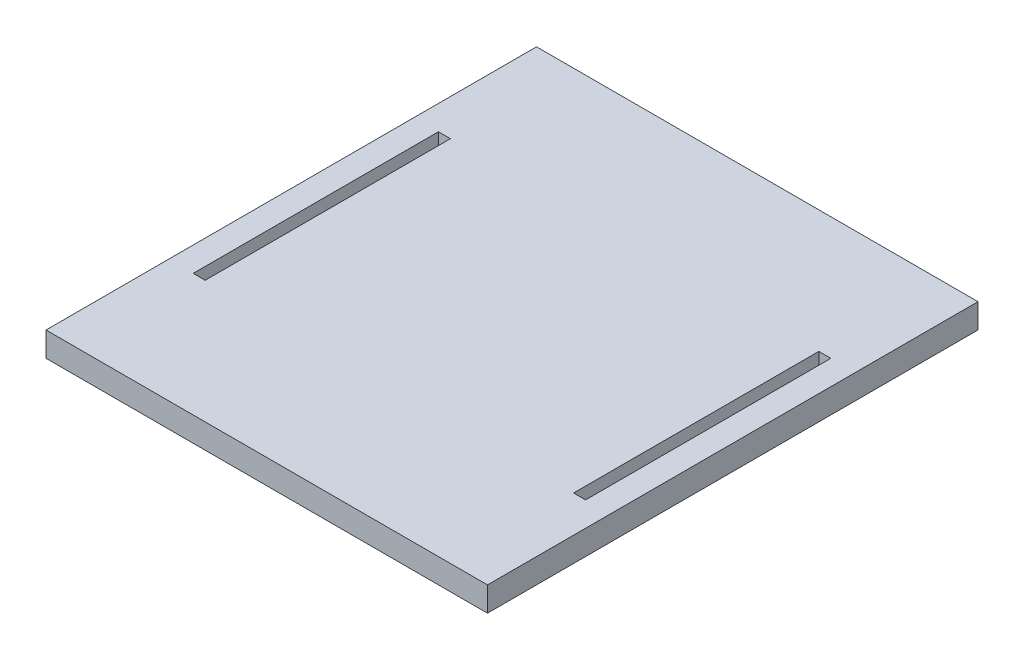
ISO-10303-21;
HEADER;
FILE_DESCRIPTION(('STEP AP214'),'2;1');
FILE_NAME('part.step','',(''),(''),'','','');
FILE_SCHEMA(('AUTOMOTIVE_DESIGN { 1 0 10303 214 1 1 1 1 }'));
ENDSEC;
DATA;
#1=APPLICATION_CONTEXT('core data for automotive mechanical design processes');
#2=APPLICATION_PROTOCOL_DEFINITION('international standard','automotive_design',2000,#1);
#3=PRODUCT_CONTEXT('',#1,'mechanical');
#4=PRODUCT('Part','Part','',(#3));
#5=PRODUCT_RELATED_PRODUCT_CATEGORY('part','',(#4));
#6=PRODUCT_DEFINITION_FORMATION('','',#4);
#7=PRODUCT_DEFINITION_CONTEXT('part definition',#1,'design');
#8=PRODUCT_DEFINITION('design','',#6,#7);
#9=PRODUCT_DEFINITION_SHAPE('','',#8);
#10=(LENGTH_UNIT() NAMED_UNIT(*) SI_UNIT(.MILLI.,.METRE.));
#11=(NAMED_UNIT(*) PLANE_ANGLE_UNIT() SI_UNIT($,.RADIAN.));
#12=(NAMED_UNIT(*) SI_UNIT($,.STERADIAN.) SOLID_ANGLE_UNIT());
#13=UNCERTAINTY_MEASURE_WITH_UNIT(LENGTH_MEASURE(1.E-05),#10,'distance_accuracy_value','');
#14=(GEOMETRIC_REPRESENTATION_CONTEXT(3) GLOBAL_UNCERTAINTY_ASSIGNED_CONTEXT((#13)) GLOBAL_UNIT_ASSIGNED_CONTEXT((#10,
#11,#12)) REPRESENTATION_CONTEXT('',''));
#15=CARTESIAN_POINT('',(0.,0.,0.));
#16=DIRECTION('',(0.,0.,1.));
#17=DIRECTION('',(1.,0.,0.));
#18=AXIS2_PLACEMENT_3D('',#15,#16,#17);
#19=CARTESIAN_POINT('',(0.,10.,0.));
#20=DIRECTION('',(0.,-1.,0.));
#21=DIRECTION('',(0.,0.,-1.));
#22=AXIS2_PLACEMENT_3D('',#19,#20,#21);
#23=PLANE('',#22);
#24=DIRECTION('',(0.,0.,-1.));
#25=VECTOR('',#24,1.);
#26=CARTESIAN_POINT('',(-75.1,10.,50.));
#27=LINE('',#26,#25);
#28=CARTESIAN_POINT('',(-75.1,10.,50.));
#29=VERTEX_POINT('',#28);
#30=CARTESIAN_POINT('',(-75.1,10.,-50.));
#31=VERTEX_POINT('',#30);
#32=EDGE_CURVE('E158',#29,#31,#27,.T.);
#33=ORIENTED_EDGE('',*,*,#32,.F.);
#34=DIRECTION('',(1.,0.,0.));
#35=VECTOR('',#34,1.);
#36=CARTESIAN_POINT('',(-80.,10.,50.));
#37=LINE('',#36,#35);
#38=CARTESIAN_POINT('',(-80.,10.,50.));
#39=VERTEX_POINT('',#38);
#40=EDGE_CURVE('E166',#39,#29,#37,.T.);
#41=ORIENTED_EDGE('',*,*,#40,.F.);
#42=DIRECTION('',(0.,0.,1.));
#43=VECTOR('',#42,1.);
#44=CARTESIAN_POINT('',(-80.,10.,50.));
#45=LINE('',#44,#43);
#46=CARTESIAN_POINT('',(-80.,10.,-50.));
#47=VERTEX_POINT('',#46);
#48=EDGE_CURVE('E163',#47,#39,#45,.T.);
#49=ORIENTED_EDGE('',*,*,#48,.F.);
#50=DIRECTION('',(-1.,0.,0.));
#51=VECTOR('',#50,1.);
#52=CARTESIAN_POINT('',(-80.,10.,-50.));
#53=LINE('',#52,#51);
#54=EDGE_CURVE('E160',#31,#47,#53,.T.);
#55=ORIENTED_EDGE('',*,*,#54,.F.);
#56=EDGE_LOOP('',(#33,#41,#49,#55));
#57=FACE_BOUND('',#56,.T.);
#58=DIRECTION('',(0.,0.,-1.));
#59=VECTOR('',#58,1.);
#60=CARTESIAN_POINT('',(90.,10.,100.));
#61=LINE('',#60,#59);
#62=CARTESIAN_POINT('',(90.,10.,100.));
#63=VERTEX_POINT('',#62);
#64=CARTESIAN_POINT('',(90.,10.,-100.));
#65=VERTEX_POINT('',#64);
#66=EDGE_CURVE('E189',#63,#65,#61,.T.);
#67=ORIENTED_EDGE('',*,*,#66,.T.);
#68=DIRECTION('',(-1.,0.,0.));
#69=VECTOR('',#68,1.);
#70=CARTESIAN_POINT('',(-90.,10.,-100.));
#71=LINE('',#70,#69);
#72=CARTESIAN_POINT('',(-90.,10.,-100.));
#73=VERTEX_POINT('',#72);
#74=EDGE_CURVE('E192',#65,#73,#71,.T.);
#75=ORIENTED_EDGE('',*,*,#74,.T.);
#76=DIRECTION('',(0.,0.,1.));
#77=VECTOR('',#76,1.);
#78=CARTESIAN_POINT('',(-90.,10.,100.));
#79=LINE('',#78,#77);
#80=CARTESIAN_POINT('',(-90.,10.,100.));
#81=VERTEX_POINT('',#80);
#82=EDGE_CURVE('E195',#73,#81,#79,.T.);
#83=ORIENTED_EDGE('',*,*,#82,.T.);
#84=DIRECTION('',(1.,0.,0.));
#85=VECTOR('',#84,1.);
#86=CARTESIAN_POINT('',(-90.,10.,100.));
#87=LINE('',#86,#85);
#88=EDGE_CURVE('E197',#81,#63,#87,.T.);
#89=ORIENTED_EDGE('',*,*,#88,.T.);
#90=EDGE_LOOP('',(#67,#75,#83,#89));
#91=FACE_BOUND('',#90,.T.);
#92=DIRECTION('',(0.,0.,-1.));
#93=VECTOR('',#92,1.);
#94=CARTESIAN_POINT('',(80.,10.,50.));
#95=LINE('',#94,#93);
#96=CARTESIAN_POINT('',(80.,10.,50.));
#97=VERTEX_POINT('',#96);
#98=CARTESIAN_POINT('',(80.,10.,-50.));
#99=VERTEX_POINT('',#98);
#100=EDGE_CURVE('E122',#97,#99,#95,.T.);
#101=ORIENTED_EDGE('',*,*,#100,.F.);
#102=DIRECTION('',(1.,0.,0.));
#103=VECTOR('',#102,1.);
#104=CARTESIAN_POINT('',(75.1,10.,50.));
#105=LINE('',#104,#103);
#106=CARTESIAN_POINT('',(75.1,10.,50.));
#107=VERTEX_POINT('',#106);
#108=EDGE_CURVE('E144',#107,#97,#105,.T.);
#109=ORIENTED_EDGE('',*,*,#108,.F.);
#110=DIRECTION('',(0.,0.,1.));
#111=VECTOR('',#110,1.);
#112=CARTESIAN_POINT('',(75.1,10.,50.));
#113=LINE('',#112,#111);
#114=CARTESIAN_POINT('',(75.1,10.,-50.));
#115=VERTEX_POINT('',#114);
#116=EDGE_CURVE('E142',#115,#107,#113,.T.);
#117=ORIENTED_EDGE('',*,*,#116,.F.);
#118=DIRECTION('',(-1.,0.,0.));
#119=VECTOR('',#118,1.);
#120=CARTESIAN_POINT('',(75.1,10.,-50.));
#121=LINE('',#120,#119);
#122=EDGE_CURVE('E130',#99,#115,#121,.T.);
#123=ORIENTED_EDGE('',*,*,#122,.F.);
#124=EDGE_LOOP('',(#101,#109,#117,#123));
#125=FACE_BOUND('',#124,.T.);
#126=ADVANCED_FACE('F33',(#57,#91,#125),#23,.F.);
#127=CARTESIAN_POINT('',(0.,0.,0.));
#128=DIRECTION('',(0.,-1.,0.));
#129=DIRECTION('',(0.,0.,-1.));
#130=AXIS2_PLACEMENT_3D('',#127,#128,#129);
#131=PLANE('',#130);
#132=DIRECTION('',(1.,0.,0.));
#133=VECTOR('',#132,1.);
#134=CARTESIAN_POINT('',(-80.,0.,50.));
#135=LINE('',#134,#133);
#136=CARTESIAN_POINT('',(-80.,0.,50.));
#137=VERTEX_POINT('',#136);
#138=CARTESIAN_POINT('',(-75.1,0.,50.));
#139=VERTEX_POINT('',#138);
#140=EDGE_CURVE('E161',#137,#139,#135,.T.);
#141=ORIENTED_EDGE('',*,*,#140,.T.);
#142=DIRECTION('',(0.,0.,-1.));
#143=VECTOR('',#142,1.);
#144=CARTESIAN_POINT('',(-75.1,0.,50.));
#145=LINE('',#144,#143);
#146=CARTESIAN_POINT('',(-75.1,0.,-50.));
#147=VERTEX_POINT('',#146);
#148=EDGE_CURVE('E138',#139,#147,#145,.T.);
#149=ORIENTED_EDGE('',*,*,#148,.T.);
#150=DIRECTION('',(-1.,0.,0.));
#151=VECTOR('',#150,1.);
#152=CARTESIAN_POINT('',(-80.,0.,-50.));
#153=LINE('',#152,#151);
#154=CARTESIAN_POINT('',(-80.,0.,-50.));
#155=VERTEX_POINT('',#154);
#156=EDGE_CURVE('E171',#147,#155,#153,.T.);
#157=ORIENTED_EDGE('',*,*,#156,.T.);
#158=DIRECTION('',(0.,0.,1.));
#159=VECTOR('',#158,1.);
#160=CARTESIAN_POINT('',(-80.,0.,50.));
#161=LINE('',#160,#159);
#162=EDGE_CURVE('E174',#155,#137,#161,.T.);
#163=ORIENTED_EDGE('',*,*,#162,.T.);
#164=EDGE_LOOP('',(#141,#149,#157,#163));
#165=FACE_BOUND('',#164,.T.);
#166=DIRECTION('',(0.,0.,-1.));
#167=VECTOR('',#166,1.);
#168=CARTESIAN_POINT('',(90.,0.,100.));
#169=LINE('',#168,#167);
#170=CARTESIAN_POINT('',(90.,0.,100.));
#171=VERTEX_POINT('',#170);
#172=CARTESIAN_POINT('',(90.,0.,-100.));
#173=VERTEX_POINT('',#172);
#174=EDGE_CURVE('E188',#171,#173,#169,.T.);
#175=ORIENTED_EDGE('',*,*,#174,.F.);
#176=DIRECTION('',(1.,0.,0.));
#177=VECTOR('',#176,1.);
#178=CARTESIAN_POINT('',(-90.,0.,100.));
#179=LINE('',#178,#177);
#180=CARTESIAN_POINT('',(-90.,0.,100.));
#181=VERTEX_POINT('',#180);
#182=EDGE_CURVE('E193',#181,#171,#179,.T.);
#183=ORIENTED_EDGE('',*,*,#182,.F.);
#184=DIRECTION('',(0.,0.,1.));
#185=VECTOR('',#184,1.);
#186=CARTESIAN_POINT('',(-90.,0.,100.));
#187=LINE('',#186,#185);
#188=CARTESIAN_POINT('',(-90.,0.,-100.));
#189=VERTEX_POINT('',#188);
#190=EDGE_CURVE('E204',#189,#181,#187,.T.);
#191=ORIENTED_EDGE('',*,*,#190,.F.);
#192=DIRECTION('',(-1.,0.,0.));
#193=VECTOR('',#192,1.);
#194=CARTESIAN_POINT('',(-90.,0.,-100.));
#195=LINE('',#194,#193);
#196=EDGE_CURVE('E202',#173,#189,#195,.T.);
#197=ORIENTED_EDGE('',*,*,#196,.F.);
#198=EDGE_LOOP('',(#175,#183,#191,#197));
#199=FACE_BOUND('',#198,.T.);
#200=DIRECTION('',(1.,0.,0.));
#201=VECTOR('',#200,1.);
#202=CARTESIAN_POINT('',(75.1,0.,50.));
#203=LINE('',#202,#201);
#204=CARTESIAN_POINT('',(75.1,0.,50.));
#205=VERTEX_POINT('',#204);
#206=CARTESIAN_POINT('',(80.,0.,50.));
#207=VERTEX_POINT('',#206);
#208=EDGE_CURVE('E131',#205,#207,#203,.T.);
#209=ORIENTED_EDGE('',*,*,#208,.T.);
#210=DIRECTION('',(0.,0.,-1.));
#211=VECTOR('',#210,1.);
#212=CARTESIAN_POINT('',(80.,0.,50.));
#213=LINE('',#212,#211);
#214=CARTESIAN_POINT('',(80.,0.,-50.));
#215=VERTEX_POINT('',#214);
#216=EDGE_CURVE('E56',#207,#215,#213,.T.);
#217=ORIENTED_EDGE('',*,*,#216,.T.);
#218=DIRECTION('',(-1.,0.,0.));
#219=VECTOR('',#218,1.);
#220=CARTESIAN_POINT('',(75.1,0.,-50.));
#221=LINE('',#220,#219);
#222=CARTESIAN_POINT('',(75.1,0.,-50.));
#223=VERTEX_POINT('',#222);
#224=EDGE_CURVE('E137',#215,#223,#221,.T.);
#225=ORIENTED_EDGE('',*,*,#224,.T.);
#226=DIRECTION('',(0.,0.,1.));
#227=VECTOR('',#226,1.);
#228=CARTESIAN_POINT('',(75.1,0.,50.));
#229=LINE('',#228,#227);
#230=EDGE_CURVE('E150',#223,#205,#229,.T.);
#231=ORIENTED_EDGE('',*,*,#230,.T.);
#232=EDGE_LOOP('',(#209,#217,#225,#231));
#233=FACE_BOUND('',#232,.T.);
#234=ADVANCED_FACE('F222',(#165,#199,#233),#131,.T.);
#235=CARTESIAN_POINT('',(90.,10.,100.));
#236=DIRECTION('',(-1.,0.,0.));
#237=DIRECTION('',(0.,0.,1.));
#238=AXIS2_PLACEMENT_3D('',#235,#236,#237);
#239=PLANE('',#238);
#240=ORIENTED_EDGE('',*,*,#174,.T.);
#241=DIRECTION('',(0.,-1.,0.));
#242=VECTOR('',#241,1.);
#243=CARTESIAN_POINT('',(90.,10.,-100.));
#244=LINE('',#243,#242);
#245=EDGE_CURVE('E11',#65,#173,#244,.T.);
#246=ORIENTED_EDGE('',*,*,#245,.F.);
#247=ORIENTED_EDGE('',*,*,#66,.F.);
#248=DIRECTION('',(0.,-1.,0.));
#249=VECTOR('',#248,1.);
#250=CARTESIAN_POINT('',(90.,10.,100.));
#251=LINE('',#250,#249);
#252=EDGE_CURVE('E199',#63,#171,#251,.T.);
#253=ORIENTED_EDGE('',*,*,#252,.T.);
#254=EDGE_LOOP('',(#240,#246,#247,#253));
#255=FACE_BOUND('',#254,.T.);
#256=ADVANCED_FACE('F35',(#255),#239,.F.);
#257=CARTESIAN_POINT('',(-90.,10.,-100.));
#258=DIRECTION('',(0.,0.,1.));
#259=DIRECTION('',(1.,0.,0.));
#260=AXIS2_PLACEMENT_3D('',#257,#258,#259);
#261=PLANE('',#260);
#262=ORIENTED_EDGE('',*,*,#196,.T.);
#263=DIRECTION('',(0.,-1.,0.));
#264=VECTOR('',#263,1.);
#265=CARTESIAN_POINT('',(-90.,10.,-100.));
#266=LINE('',#265,#264);
#267=EDGE_CURVE('E41',#73,#189,#266,.T.);
#268=ORIENTED_EDGE('',*,*,#267,.F.);
#269=ORIENTED_EDGE('',*,*,#74,.F.);
#270=ORIENTED_EDGE('',*,*,#245,.T.);
#271=EDGE_LOOP('',(#262,#268,#269,#270));
#272=FACE_BOUND('',#271,.T.);
#273=ADVANCED_FACE('F232',(#272),#261,.F.);
#274=CARTESIAN_POINT('',(-90.,10.,100.));
#275=DIRECTION('',(1.,0.,0.));
#276=DIRECTION('',(0.,0.,-1.));
#277=AXIS2_PLACEMENT_3D('',#274,#275,#276);
#278=PLANE('',#277);
#279=ORIENTED_EDGE('',*,*,#190,.T.);
#280=DIRECTION('',(0.,-1.,0.));
#281=VECTOR('',#280,1.);
#282=CARTESIAN_POINT('',(-90.,10.,100.));
#283=LINE('',#282,#281);
#284=EDGE_CURVE('E209',#81,#181,#283,.T.);
#285=ORIENTED_EDGE('',*,*,#284,.F.);
#286=ORIENTED_EDGE('',*,*,#82,.F.);
#287=ORIENTED_EDGE('',*,*,#267,.T.);
#288=EDGE_LOOP('',(#279,#285,#286,#287));
#289=FACE_BOUND('',#288,.T.);
#290=ADVANCED_FACE('F216',(#289),#278,.F.);
#291=CARTESIAN_POINT('',(-90.,10.,100.));
#292=DIRECTION('',(0.,0.,-1.));
#293=DIRECTION('',(-1.,0.,0.));
#294=AXIS2_PLACEMENT_3D('',#291,#292,#293);
#295=PLANE('',#294);
#296=ORIENTED_EDGE('',*,*,#182,.T.);
#297=ORIENTED_EDGE('',*,*,#252,.F.);
#298=ORIENTED_EDGE('',*,*,#88,.F.);
#299=ORIENTED_EDGE('',*,*,#284,.T.);
#300=EDGE_LOOP('',(#296,#297,#298,#299));
#301=FACE_BOUND('',#300,.T.);
#302=ADVANCED_FACE('F226',(#301),#295,.F.);
#303=CARTESIAN_POINT('',(-75.1,10.,50.));
#304=DIRECTION('',(-1.,0.,0.));
#305=DIRECTION('',(0.,0.,1.));
#306=AXIS2_PLACEMENT_3D('',#303,#304,#305);
#307=PLANE('',#306);
#308=ORIENTED_EDGE('',*,*,#148,.F.);
#309=DIRECTION('',(0.,-1.,0.));
#310=VECTOR('',#309,1.);
#311=CARTESIAN_POINT('',(-75.1,10.,50.));
#312=LINE('',#311,#310);
#313=EDGE_CURVE('E168',#29,#139,#312,.T.);
#314=ORIENTED_EDGE('',*,*,#313,.F.);
#315=ORIENTED_EDGE('',*,*,#32,.T.);
#316=DIRECTION('',(0.,-1.,0.));
#317=VECTOR('',#316,1.);
#318=CARTESIAN_POINT('',(-75.1,10.,-50.));
#319=LINE('',#318,#317);
#320=EDGE_CURVE('E185',#31,#147,#319,.T.);
#321=ORIENTED_EDGE('',*,*,#320,.T.);
#322=EDGE_LOOP('',(#308,#314,#315,#321));
#323=FACE_BOUND('',#322,.T.);
#324=ADVANCED_FACE('F249',(#323),#307,.T.);
#325=CARTESIAN_POINT('',(-80.,10.,-50.));
#326=DIRECTION('',(0.,0.,1.));
#327=DIRECTION('',(1.,0.,0.));
#328=AXIS2_PLACEMENT_3D('',#325,#326,#327);
#329=PLANE('',#328);
#330=ORIENTED_EDGE('',*,*,#156,.F.);
#331=ORIENTED_EDGE('',*,*,#320,.F.);
#332=ORIENTED_EDGE('',*,*,#54,.T.);
#333=DIRECTION('',(0.,-1.,0.));
#334=VECTOR('',#333,1.);
#335=CARTESIAN_POINT('',(-80.,10.,-50.));
#336=LINE('',#335,#334);
#337=EDGE_CURVE('E183',#47,#155,#336,.T.);
#338=ORIENTED_EDGE('',*,*,#337,.T.);
#339=EDGE_LOOP('',(#330,#331,#332,#338));
#340=FACE_BOUND('',#339,.T.);
#341=ADVANCED_FACE('F256',(#340),#329,.T.);
#342=CARTESIAN_POINT('',(-80.,10.,50.));
#343=DIRECTION('',(1.,0.,0.));
#344=DIRECTION('',(0.,0.,-1.));
#345=AXIS2_PLACEMENT_3D('',#342,#343,#344);
#346=PLANE('',#345);
#347=ORIENTED_EDGE('',*,*,#162,.F.);
#348=ORIENTED_EDGE('',*,*,#337,.F.);
#349=ORIENTED_EDGE('',*,*,#48,.T.);
#350=DIRECTION('',(0.,-1.,0.));
#351=VECTOR('',#350,1.);
#352=CARTESIAN_POINT('',(-80.,10.,50.));
#353=LINE('',#352,#351);
#354=EDGE_CURVE('E181',#39,#137,#353,.T.);
#355=ORIENTED_EDGE('',*,*,#354,.T.);
#356=EDGE_LOOP('',(#347,#348,#349,#355));
#357=FACE_BOUND('',#356,.T.);
#358=ADVANCED_FACE('F261',(#357),#346,.T.);
#359=CARTESIAN_POINT('',(-80.,10.,50.));
#360=DIRECTION('',(0.,0.,-1.));
#361=DIRECTION('',(-1.,0.,0.));
#362=AXIS2_PLACEMENT_3D('',#359,#360,#361);
#363=PLANE('',#362);
#364=ORIENTED_EDGE('',*,*,#140,.F.);
#365=ORIENTED_EDGE('',*,*,#354,.F.);
#366=ORIENTED_EDGE('',*,*,#40,.T.);
#367=ORIENTED_EDGE('',*,*,#313,.T.);
#368=EDGE_LOOP('',(#364,#365,#366,#367));
#369=FACE_BOUND('',#368,.T.);
#370=ADVANCED_FACE('F267',(#369),#363,.T.);
#371=CARTESIAN_POINT('',(80.,10.,50.));
#372=DIRECTION('',(-1.,0.,0.));
#373=DIRECTION('',(0.,0.,1.));
#374=AXIS2_PLACEMENT_3D('',#371,#372,#373);
#375=PLANE('',#374);
#376=ORIENTED_EDGE('',*,*,#216,.F.);
#377=DIRECTION('',(0.,-1.,0.));
#378=VECTOR('',#377,1.);
#379=CARTESIAN_POINT('',(80.,10.,50.));
#380=LINE('',#379,#378);
#381=EDGE_CURVE('E126',#97,#207,#380,.T.);
#382=ORIENTED_EDGE('',*,*,#381,.F.);
#383=ORIENTED_EDGE('',*,*,#100,.T.);
#384=DIRECTION('',(0.,-1.,0.));
#385=VECTOR('',#384,1.);
#386=CARTESIAN_POINT('',(80.,10.,-50.));
#387=LINE('',#386,#385);
#388=EDGE_CURVE('E125',#99,#215,#387,.T.);
#389=ORIENTED_EDGE('',*,*,#388,.T.);
#390=EDGE_LOOP('',(#376,#382,#383,#389));
#391=FACE_BOUND('',#390,.T.);
#392=ADVANCED_FACE('F124',(#391),#375,.T.);
#393=CARTESIAN_POINT('',(75.1,10.,-50.));
#394=DIRECTION('',(0.,0.,1.));
#395=DIRECTION('',(1.,0.,0.));
#396=AXIS2_PLACEMENT_3D('',#393,#394,#395);
#397=PLANE('',#396);
#398=ORIENTED_EDGE('',*,*,#224,.F.);
#399=ORIENTED_EDGE('',*,*,#388,.F.);
#400=ORIENTED_EDGE('',*,*,#122,.T.);
#401=DIRECTION('',(0.,-1.,0.));
#402=VECTOR('',#401,1.);
#403=CARTESIAN_POINT('',(75.1,10.,-50.));
#404=LINE('',#403,#402);
#405=EDGE_CURVE('E139',#115,#223,#404,.T.);
#406=ORIENTED_EDGE('',*,*,#405,.T.);
#407=EDGE_LOOP('',(#398,#399,#400,#406));
#408=FACE_BOUND('',#407,.T.);
#409=ADVANCED_FACE('F134',(#408),#397,.T.);
#410=CARTESIAN_POINT('',(75.1,10.,50.));
#411=DIRECTION('',(1.,0.,0.));
#412=DIRECTION('',(0.,0.,-1.));
#413=AXIS2_PLACEMENT_3D('',#410,#411,#412);
#414=PLANE('',#413);
#415=ORIENTED_EDGE('',*,*,#230,.F.);
#416=ORIENTED_EDGE('',*,*,#405,.F.);
#417=ORIENTED_EDGE('',*,*,#116,.T.);
#418=DIRECTION('',(0.,-1.,0.));
#419=VECTOR('',#418,1.);
#420=CARTESIAN_POINT('',(75.1,10.,50.));
#421=LINE('',#420,#419);
#422=EDGE_CURVE('E48',#107,#205,#421,.T.);
#423=ORIENTED_EDGE('',*,*,#422,.T.);
#424=EDGE_LOOP('',(#415,#416,#417,#423));
#425=FACE_BOUND('',#424,.T.);
#426=ADVANCED_FACE('F285',(#425),#414,.T.);
#427=CARTESIAN_POINT('',(75.1,10.,50.));
#428=DIRECTION('',(0.,0.,-1.));
#429=DIRECTION('',(-1.,0.,0.));
#430=AXIS2_PLACEMENT_3D('',#427,#428,#429);
#431=PLANE('',#430);
#432=ORIENTED_EDGE('',*,*,#208,.F.);
#433=ORIENTED_EDGE('',*,*,#422,.F.);
#434=ORIENTED_EDGE('',*,*,#108,.T.);
#435=ORIENTED_EDGE('',*,*,#381,.T.);
#436=EDGE_LOOP('',(#432,#433,#434,#435));
#437=FACE_BOUND('',#436,.T.);
#438=ADVANCED_FACE('F288',(#437),#431,.T.);
#439=CLOSED_SHELL('',(#126,#234,#256,#273,#290,#302,#324,#341,#358,#370,#392,#409,#426,#438));
#440=MANIFOLD_SOLID_BREP('B2',#439);
#441=ADVANCED_BREP_SHAPE_REPRESENTATION('',(#18,#440),#14);
#442=SHAPE_DEFINITION_REPRESENTATION(#9,#441);
ENDSEC;
END-ISO-10303-21;
